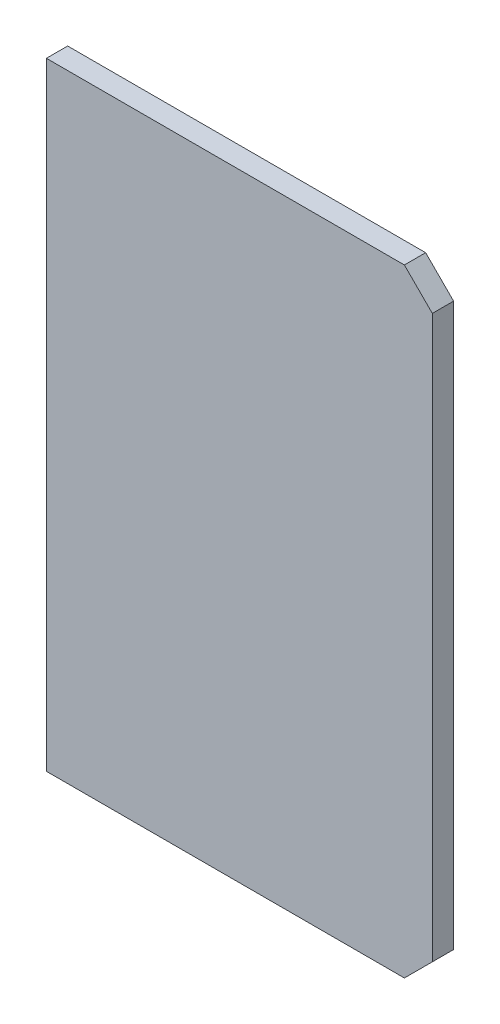
ISO-10303-21;
HEADER;
FILE_DESCRIPTION(('STEP AP214'),'2;1');
FILE_NAME('part.step','',(''),(''),'','','');
FILE_SCHEMA(('AUTOMOTIVE_DESIGN { 1 0 10303 214 1 1 1 1 }'));
ENDSEC;
DATA;
#1=APPLICATION_CONTEXT('core data for automotive mechanical design processes');
#2=APPLICATION_PROTOCOL_DEFINITION('international standard','automotive_design',2000,#1);
#3=PRODUCT_CONTEXT('',#1,'mechanical');
#4=PRODUCT('Part','Part','',(#3));
#5=PRODUCT_RELATED_PRODUCT_CATEGORY('part','',(#4));
#6=PRODUCT_DEFINITION_FORMATION('','',#4);
#7=PRODUCT_DEFINITION_CONTEXT('part definition',#1,'design');
#8=PRODUCT_DEFINITION('design','',#6,#7);
#9=PRODUCT_DEFINITION_SHAPE('','',#8);
#10=(LENGTH_UNIT() NAMED_UNIT(*) SI_UNIT(.MILLI.,.METRE.));
#11=(NAMED_UNIT(*) PLANE_ANGLE_UNIT() SI_UNIT($,.RADIAN.));
#12=(NAMED_UNIT(*) SI_UNIT($,.STERADIAN.) SOLID_ANGLE_UNIT());
#13=UNCERTAINTY_MEASURE_WITH_UNIT(LENGTH_MEASURE(1.E-05),#10,'distance_accuracy_value','');
#14=(GEOMETRIC_REPRESENTATION_CONTEXT(3) GLOBAL_UNCERTAINTY_ASSIGNED_CONTEXT((#13)) GLOBAL_UNIT_ASSIGNED_CONTEXT((#10,
#11,#12)) REPRESENTATION_CONTEXT('',''));
#15=CARTESIAN_POINT('',(0.,0.,0.));
#16=DIRECTION('',(0.,0.,1.));
#17=DIRECTION('',(1.,0.,0.));
#18=AXIS2_PLACEMENT_3D('',#15,#16,#17);
#19=CARTESIAN_POINT('',(3.175,0.12,0.));
#20=DIRECTION('',(0.,0.,1.));
#21=DIRECTION('',(1.,0.,0.));
#22=AXIS2_PLACEMENT_3D('',#19,#20,#21);
#23=PLANE('',#22);
#24=DIRECTION('',(0.,1.,0.));
#25=VECTOR('',#24,1.);
#26=CARTESIAN_POINT('',(9.525,0.12,0.));
#27=LINE('',#26,#25);
#28=CARTESIAN_POINT('',(9.525,0.58,0.));
#29=VERTEX_POINT('',#28);
#30=CARTESIAN_POINT('',(9.525,9.82,0.));
#31=VERTEX_POINT('',#30);
#32=EDGE_CURVE('E103',#29,#31,#27,.T.);
#33=ORIENTED_EDGE('',*,*,#32,.F.);
#34=DIRECTION('',(0.707106781186548,0.707106781186548,0.));
#35=VECTOR('',#34,1.);
#36=CARTESIAN_POINT('',(9.065,0.12,0.));
#37=LINE('',#36,#35);
#38=CARTESIAN_POINT('',(9.065,0.12,0.));
#39=VERTEX_POINT('',#38);
#40=EDGE_CURVE('E95',#39,#29,#37,.T.);
#41=ORIENTED_EDGE('',*,*,#40,.F.);
#42=DIRECTION('',(1.,0.,0.));
#43=VECTOR('',#42,1.);
#44=CARTESIAN_POINT('',(3.175,0.12,0.));
#45=LINE('',#44,#43);
#46=CARTESIAN_POINT('',(3.175,0.12,0.));
#47=VERTEX_POINT('',#46);
#48=EDGE_CURVE('E68',#39,#47,#45,.F.);
#49=ORIENTED_EDGE('',*,*,#48,.T.);
#50=DIRECTION('',(0.,1.,0.));
#51=VECTOR('',#50,1.);
#52=CARTESIAN_POINT('',(3.175,0.12,0.));
#53=LINE('',#52,#51);
#54=CARTESIAN_POINT('',(3.175,10.28,0.));
#55=VERTEX_POINT('',#54);
#56=EDGE_CURVE('E71',#47,#55,#53,.T.);
#57=ORIENTED_EDGE('',*,*,#56,.T.);
#58=DIRECTION('',(1.,0.,0.));
#59=VECTOR('',#58,1.);
#60=CARTESIAN_POINT('',(3.175,10.28,0.));
#61=LINE('',#60,#59);
#62=CARTESIAN_POINT('',(9.065,10.28,0.));
#63=VERTEX_POINT('',#62);
#64=EDGE_CURVE('E74',#63,#55,#61,.F.);
#65=ORIENTED_EDGE('',*,*,#64,.F.);
#66=DIRECTION('',(-0.707106781186549,0.707106781186546,0.));
#67=VECTOR('',#66,1.);
#68=CARTESIAN_POINT('',(9.525,9.82,0.));
#69=LINE('',#68,#67);
#70=EDGE_CURVE('E20',#31,#63,#69,.T.);
#71=ORIENTED_EDGE('',*,*,#70,.F.);
#72=EDGE_LOOP('',(#33,#41,#49,#57,#65,#71));
#73=FACE_BOUND('',#72,.T.);
#74=ADVANCED_FACE('F17',(#73),#23,.F.);
#75=CARTESIAN_POINT('',(3.175,10.28,0.));
#76=DIRECTION('',(0.,1.,0.));
#77=DIRECTION('',(0.,0.,1.));
#78=AXIS2_PLACEMENT_3D('',#75,#76,#77);
#79=PLANE('',#78);
#80=DIRECTION('',(1.,0.,0.));
#81=VECTOR('',#80,1.);
#82=CARTESIAN_POINT('',(3.175,10.28,0.35));
#83=LINE('',#82,#81);
#84=CARTESIAN_POINT('',(9.065,10.28,0.35));
#85=VERTEX_POINT('',#84);
#86=CARTESIAN_POINT('',(3.175,10.28,0.35));
#87=VERTEX_POINT('',#86);
#88=EDGE_CURVE('E107',#85,#87,#83,.F.);
#89=ORIENTED_EDGE('',*,*,#88,.F.);
#90=DIRECTION('',(0.,0.,1.));
#91=VECTOR('',#90,1.);
#92=CARTESIAN_POINT('',(9.065,10.28,0.));
#93=LINE('',#92,#91);
#94=EDGE_CURVE('E85',#63,#85,#93,.T.);
#95=ORIENTED_EDGE('',*,*,#94,.F.);
#96=ORIENTED_EDGE('',*,*,#64,.T.);
#97=DIRECTION('',(0.,0.,-1.));
#98=VECTOR('',#97,1.);
#99=CARTESIAN_POINT('',(3.175,10.28,0.));
#100=LINE('',#99,#98);
#101=EDGE_CURVE('E79',#55,#87,#100,.F.);
#102=ORIENTED_EDGE('',*,*,#101,.T.);
#103=EDGE_LOOP('',(#89,#95,#96,#102));
#104=FACE_BOUND('',#103,.T.);
#105=ADVANCED_FACE('F82',(#104),#79,.T.);
#106=CARTESIAN_POINT('',(3.175,0.12,0.));
#107=DIRECTION('',(1.,0.,0.));
#108=DIRECTION('',(0.,0.,-1.));
#109=AXIS2_PLACEMENT_3D('',#106,#107,#108);
#110=PLANE('',#109);
#111=ORIENTED_EDGE('',*,*,#101,.F.);
#112=ORIENTED_EDGE('',*,*,#56,.F.);
#113=DIRECTION('',(0.,0.,1.));
#114=VECTOR('',#113,1.);
#115=CARTESIAN_POINT('',(3.175,0.12,0.));
#116=LINE('',#115,#114);
#117=CARTESIAN_POINT('',(3.175,0.12,0.35));
#118=VERTEX_POINT('',#117);
#119=EDGE_CURVE('E91',#47,#118,#116,.T.);
#120=ORIENTED_EDGE('',*,*,#119,.T.);
#121=DIRECTION('',(0.,1.,0.));
#122=VECTOR('',#121,1.);
#123=CARTESIAN_POINT('',(3.175,0.12,0.35));
#124=LINE('',#123,#122);
#125=EDGE_CURVE('E88',#87,#118,#124,.F.);
#126=ORIENTED_EDGE('',*,*,#125,.F.);
#127=EDGE_LOOP('',(#111,#112,#120,#126));
#128=FACE_BOUND('',#127,.T.);
#129=ADVANCED_FACE('F86',(#128),#110,.F.);
#130=CARTESIAN_POINT('',(3.175,0.12,0.));
#131=DIRECTION('',(0.,1.,0.));
#132=DIRECTION('',(0.,0.,1.));
#133=AXIS2_PLACEMENT_3D('',#130,#131,#132);
#134=PLANE('',#133);
#135=DIRECTION('',(1.,0.,0.));
#136=VECTOR('',#135,1.);
#137=CARTESIAN_POINT('',(3.175,0.12,0.35));
#138=LINE('',#137,#136);
#139=CARTESIAN_POINT('',(9.065,0.12,0.35));
#140=VERTEX_POINT('',#139);
#141=EDGE_CURVE('E110',#118,#140,#138,.T.);
#142=ORIENTED_EDGE('',*,*,#141,.F.);
#143=ORIENTED_EDGE('',*,*,#119,.F.);
#144=ORIENTED_EDGE('',*,*,#48,.F.);
#145=DIRECTION('',(0.,0.,1.));
#146=VECTOR('',#145,1.);
#147=CARTESIAN_POINT('',(9.065,0.12,0.));
#148=LINE('',#147,#146);
#149=EDGE_CURVE('E97',#140,#39,#148,.F.);
#150=ORIENTED_EDGE('',*,*,#149,.F.);
#151=EDGE_LOOP('',(#142,#143,#144,#150));
#152=FACE_BOUND('',#151,.T.);
#153=ADVANCED_FACE('F137',(#152),#134,.F.);
#154=CARTESIAN_POINT('',(9.065,0.12,0.));
#155=DIRECTION('',(0.707106781186548,-0.707106781186548,0.));
#156=DIRECTION('',(0.707106781186548,0.707106781186548,0.));
#157=AXIS2_PLACEMENT_3D('',#154,#155,#156);
#158=PLANE('',#157);
#159=DIRECTION('',(0.707106781186548,0.707106781186547,0.));
#160=VECTOR('',#159,1.);
#161=CARTESIAN_POINT('',(9.065,0.12,0.35));
#162=LINE('',#161,#160);
#163=CARTESIAN_POINT('',(9.525,0.58,0.35));
#164=VERTEX_POINT('',#163);
#165=EDGE_CURVE('E113',#140,#164,#162,.T.);
#166=ORIENTED_EDGE('',*,*,#165,.F.);
#167=ORIENTED_EDGE('',*,*,#149,.T.);
#168=ORIENTED_EDGE('',*,*,#40,.T.);
#169=DIRECTION('',(0.,0.,-1.));
#170=VECTOR('',#169,1.);
#171=CARTESIAN_POINT('',(9.525,0.58,0.));
#172=LINE('',#171,#170);
#173=EDGE_CURVE('E100',#164,#29,#172,.T.);
#174=ORIENTED_EDGE('',*,*,#173,.F.);
#175=EDGE_LOOP('',(#166,#167,#168,#174));
#176=FACE_BOUND('',#175,.T.);
#177=ADVANCED_FACE('F122',(#176),#158,.T.);
#178=CARTESIAN_POINT('',(9.525,0.12,0.));
#179=DIRECTION('',(1.,0.,0.));
#180=DIRECTION('',(0.,0.,-1.));
#181=AXIS2_PLACEMENT_3D('',#178,#179,#180);
#182=PLANE('',#181);
#183=DIRECTION('',(0.,0.,1.));
#184=VECTOR('',#183,1.);
#185=CARTESIAN_POINT('',(9.525,9.82,0.));
#186=LINE('',#185,#184);
#187=CARTESIAN_POINT('',(9.525,9.82,0.35));
#188=VERTEX_POINT('',#187);
#189=EDGE_CURVE('E35',#188,#31,#186,.F.);
#190=ORIENTED_EDGE('',*,*,#189,.F.);
#191=DIRECTION('',(0.,1.,0.));
#192=VECTOR('',#191,1.);
#193=CARTESIAN_POINT('',(9.525,0.12,0.35));
#194=LINE('',#193,#192);
#195=EDGE_CURVE('E26',#164,#188,#194,.T.);
#196=ORIENTED_EDGE('',*,*,#195,.F.);
#197=ORIENTED_EDGE('',*,*,#173,.T.);
#198=ORIENTED_EDGE('',*,*,#32,.T.);
#199=EDGE_LOOP('',(#190,#196,#197,#198));
#200=FACE_BOUND('',#199,.T.);
#201=ADVANCED_FACE('F120',(#200),#182,.T.);
#202=CARTESIAN_POINT('',(9.065,10.28,0.));
#203=DIRECTION('',(0.707106781186548,0.707106781186548,0.));
#204=DIRECTION('',(-0.707106781186548,0.707106781186548,0.));
#205=AXIS2_PLACEMENT_3D('',#202,#203,#204);
#206=PLANE('',#205);
#207=ORIENTED_EDGE('',*,*,#189,.T.);
#208=ORIENTED_EDGE('',*,*,#70,.T.);
#209=ORIENTED_EDGE('',*,*,#94,.T.);
#210=DIRECTION('',(-0.707106781186549,0.707106781186546,0.));
#211=VECTOR('',#210,1.);
#212=CARTESIAN_POINT('',(9.525,9.82,0.35));
#213=LINE('',#212,#211);
#214=EDGE_CURVE('E11',#188,#85,#213,.T.);
#215=ORIENTED_EDGE('',*,*,#214,.F.);
#216=EDGE_LOOP('',(#207,#208,#209,#215));
#217=FACE_BOUND('',#216,.T.);
#218=ADVANCED_FACE('F124',(#217),#206,.T.);
#219=CARTESIAN_POINT('',(3.175,0.12,0.35));
#220=DIRECTION('',(0.,0.,1.));
#221=DIRECTION('',(1.,0.,0.));
#222=AXIS2_PLACEMENT_3D('',#219,#220,#221);
#223=PLANE('',#222);
#224=ORIENTED_EDGE('',*,*,#195,.T.);
#225=ORIENTED_EDGE('',*,*,#214,.T.);
#226=ORIENTED_EDGE('',*,*,#88,.T.);
#227=ORIENTED_EDGE('',*,*,#125,.T.);
#228=ORIENTED_EDGE('',*,*,#141,.T.);
#229=ORIENTED_EDGE('',*,*,#165,.T.);
#230=EDGE_LOOP('',(#224,#225,#226,#227,#228,#229));
#231=FACE_BOUND('',#230,.T.);
#232=ADVANCED_FACE('F118',(#231),#223,.T.);
#233=CLOSED_SHELL('',(#74,#105,#129,#153,#177,#201,#218,#232));
#234=MANIFOLD_SOLID_BREP('B1',#233);
#235=ADVANCED_BREP_SHAPE_REPRESENTATION('',(#18,#234),#14);
#236=SHAPE_DEFINITION_REPRESENTATION(#9,#235);
ENDSEC;
END-ISO-10303-21;
